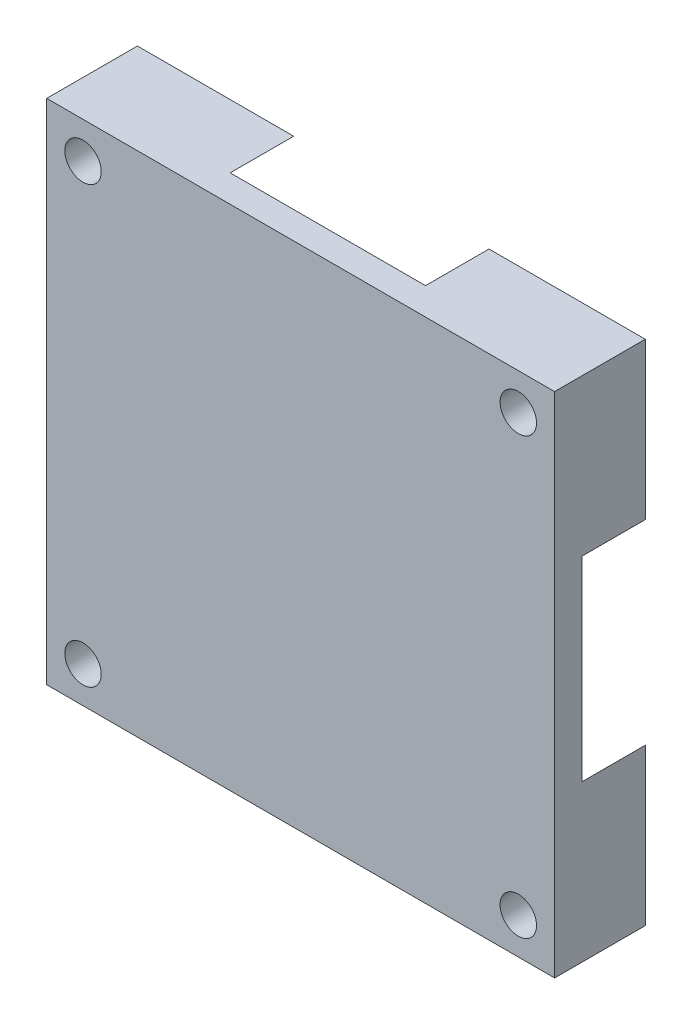
ISO-10303-21;
HEADER;
FILE_DESCRIPTION(('STEP AP214'),'2;1');
FILE_NAME('part.step','',(''),(''),'','','');
FILE_SCHEMA(('AUTOMOTIVE_DESIGN { 1 0 10303 214 1 1 1 1 }'));
ENDSEC;
DATA;
#1=APPLICATION_CONTEXT('core data for automotive mechanical design processes');
#2=APPLICATION_PROTOCOL_DEFINITION('international standard','automotive_design',2000,#1);
#3=PRODUCT_CONTEXT('',#1,'mechanical');
#4=PRODUCT('Part','Part','',(#3));
#5=PRODUCT_RELATED_PRODUCT_CATEGORY('part','',(#4));
#6=PRODUCT_DEFINITION_FORMATION('','',#4);
#7=PRODUCT_DEFINITION_CONTEXT('part definition',#1,'design');
#8=PRODUCT_DEFINITION('design','',#6,#7);
#9=PRODUCT_DEFINITION_SHAPE('','',#8);
#10=(LENGTH_UNIT() NAMED_UNIT(*) SI_UNIT(.MILLI.,.METRE.));
#11=(NAMED_UNIT(*) PLANE_ANGLE_UNIT() SI_UNIT($,.RADIAN.));
#12=(NAMED_UNIT(*) SI_UNIT($,.STERADIAN.) SOLID_ANGLE_UNIT());
#13=UNCERTAINTY_MEASURE_WITH_UNIT(LENGTH_MEASURE(1.E-05),#10,'distance_accuracy_value','');
#14=(GEOMETRIC_REPRESENTATION_CONTEXT(3) GLOBAL_UNCERTAINTY_ASSIGNED_CONTEXT((#13)) GLOBAL_UNIT_ASSIGNED_CONTEXT((#10,
#11,#12)) REPRESENTATION_CONTEXT('',''));
#15=CARTESIAN_POINT('',(0.,0.,0.));
#16=DIRECTION('',(0.,0.,1.));
#17=DIRECTION('',(1.,0.,0.));
#18=AXIS2_PLACEMENT_3D('',#15,#16,#17);
#19=CARTESIAN_POINT('',(-35.56,35.56,0.));
#20=DIRECTION('',(0.,0.,1.));
#21=DIRECTION('',(1.,0.,0.));
#22=AXIS2_PLACEMENT_3D('',#19,#20,#21);
#23=PLANE('',#22);
#24=CARTESIAN_POINT('',(30.48,30.48,0.));
#25=DIRECTION('',(0.,0.,1.));
#26=DIRECTION('',(1.,0.,0.));
#27=AXIS2_PLACEMENT_3D('',#24,#25,#26);
#28=CIRCLE('',#27,2.55269999999999);
#29=CARTESIAN_POINT('',(33.0327,30.48,0.));
#30=VERTEX_POINT('',#29);
#31=EDGE_CURVE('E241',#30,#30,#28,.T.);
#32=ORIENTED_EDGE('',*,*,#31,.T.);
#33=EDGE_LOOP('',(#32));
#34=FACE_BOUND('',#33,.T.);
#35=DIRECTION('',(0.,1.,0.));
#36=VECTOR('',#35,1.);
#37=CARTESIAN_POINT('',(35.56,-35.56,0.));
#38=LINE('',#37,#36);
#39=CARTESIAN_POINT('',(35.56,13.6783186101217,0.));
#40=VERTEX_POINT('',#39);
#41=CARTESIAN_POINT('',(35.56,35.56,0.));
#42=VERTEX_POINT('',#41);
#43=EDGE_CURVE('E181',#40,#42,#38,.T.);
#44=ORIENTED_EDGE('',*,*,#43,.F.);
#45=CARTESIAN_POINT('',(0.,0.,0.));
#46=DIRECTION('',(0.,0.,1.));
#47=DIRECTION('',(1.,0.,0.));
#48=AXIS2_PLACEMENT_3D('',#45,#46,#47);
#49=CIRCLE('',#48,38.1);
#50=CARTESIAN_POINT('',(13.6783186101217,35.56,0.));
#51=VERTEX_POINT('',#50);
#52=EDGE_CURVE('E40',#40,#51,#49,.T.);
#53=ORIENTED_EDGE('',*,*,#52,.T.);
#54=DIRECTION('',(-1.,0.,0.));
#55=VECTOR('',#54,1.);
#56=CARTESIAN_POINT('',(35.56,35.56,0.));
#57=LINE('',#56,#55);
#58=EDGE_CURVE('E170',#42,#51,#57,.T.);
#59=ORIENTED_EDGE('',*,*,#58,.F.);
#60=EDGE_LOOP('',(#44,#53,#59));
#61=FACE_BOUND('',#60,.T.);
#62=ADVANCED_FACE('F31',(#34,#61),#23,.F.);
#63=CARTESIAN_POINT('',(-30.48,30.48,0.));
#64=DIRECTION('',(0.,0.,1.));
#65=DIRECTION('',(1.,0.,0.));
#66=AXIS2_PLACEMENT_3D('',#63,#64,#65);
#67=CIRCLE('',#66,2.55269999999999);
#68=CARTESIAN_POINT('',(-27.9273,30.48,0.));
#69=VERTEX_POINT('',#68);
#70=EDGE_CURVE('E235',#69,#69,#67,.T.);
#71=ORIENTED_EDGE('',*,*,#70,.T.);
#72=EDGE_LOOP('',(#71));
#73=FACE_BOUND('',#72,.T.);
#74=CARTESIAN_POINT('',(-13.6783186101217,35.56,0.));
#75=VERTEX_POINT('',#74);
#76=CARTESIAN_POINT('',(-35.56,35.56,0.));
#77=VERTEX_POINT('',#76);
#78=EDGE_CURVE('E77',#75,#77,#57,.T.);
#79=ORIENTED_EDGE('',*,*,#78,.F.);
#80=CARTESIAN_POINT('',(0.,0.,0.));
#81=DIRECTION('',(0.,0.,-1.));
#82=DIRECTION('',(-1.,0.,0.));
#83=AXIS2_PLACEMENT_3D('',#80,#81,#82);
#84=CIRCLE('',#83,38.1);
#85=CARTESIAN_POINT('',(-35.56,13.6783186101217,0.));
#86=VERTEX_POINT('',#85);
#87=EDGE_CURVE('E224',#86,#75,#84,.T.);
#88=ORIENTED_EDGE('',*,*,#87,.F.);
#89=DIRECTION('',(0.,-1.,0.));
#90=VECTOR('',#89,1.);
#91=CARTESIAN_POINT('',(-35.56,-35.56,0.));
#92=LINE('',#91,#90);
#93=EDGE_CURVE('E155',#77,#86,#92,.T.);
#94=ORIENTED_EDGE('',*,*,#93,.F.);
#95=EDGE_LOOP('',(#79,#88,#94));
#96=FACE_BOUND('',#95,.T.);
#97=ADVANCED_FACE('F288',(#73,#96),#23,.F.);
#98=CARTESIAN_POINT('',(-30.48,-30.48,0.));
#99=DIRECTION('',(0.,0.,1.));
#100=DIRECTION('',(1.,0.,0.));
#101=AXIS2_PLACEMENT_3D('',#98,#99,#100);
#102=CIRCLE('',#101,2.5527);
#103=CARTESIAN_POINT('',(-27.9273,-30.48,0.));
#104=VERTEX_POINT('',#103);
#105=EDGE_CURVE('E229',#104,#104,#102,.T.);
#106=ORIENTED_EDGE('',*,*,#105,.T.);
#107=EDGE_LOOP('',(#106));
#108=FACE_BOUND('',#107,.T.);
#109=CARTESIAN_POINT('',(-35.56,-13.6783186101217,0.));
#110=VERTEX_POINT('',#109);
#111=CARTESIAN_POINT('',(-35.56,-35.56,0.));
#112=VERTEX_POINT('',#111);
#113=EDGE_CURVE('E142',#110,#112,#92,.T.);
#114=ORIENTED_EDGE('',*,*,#113,.F.);
#115=CARTESIAN_POINT('',(-13.6783186101217,-35.56,0.));
#116=VERTEX_POINT('',#115);
#117=EDGE_CURVE('E197',#110,#116,#49,.T.);
#118=ORIENTED_EDGE('',*,*,#117,.T.);
#119=DIRECTION('',(1.,0.,0.));
#120=VECTOR('',#119,1.);
#121=CARTESIAN_POINT('',(35.56,-35.56,0.));
#122=LINE('',#121,#120);
#123=EDGE_CURVE('E178',#112,#116,#122,.T.);
#124=ORIENTED_EDGE('',*,*,#123,.F.);
#125=EDGE_LOOP('',(#114,#118,#124));
#126=FACE_BOUND('',#125,.T.);
#127=ADVANCED_FACE('F268',(#108,#126),#23,.F.);
#128=CARTESIAN_POINT('',(-35.56,-35.56,12.7));
#129=DIRECTION('',(1.,0.,0.));
#130=DIRECTION('',(0.,0.,-1.));
#131=AXIS2_PLACEMENT_3D('',#128,#129,#130);
#132=PLANE('',#131);
#133=DIRECTION('',(0.,1.,0.));
#134=VECTOR('',#133,1.);
#135=CARTESIAN_POINT('',(-35.56,-35.56,8.89));
#136=LINE('',#135,#134);
#137=CARTESIAN_POINT('',(-35.56,-13.6783186101217,8.89));
#138=VERTEX_POINT('',#137);
#139=CARTESIAN_POINT('',(-35.56,13.6783186101217,8.89));
#140=VERTEX_POINT('',#139);
#141=EDGE_CURVE('E132',#138,#140,#136,.T.);
#142=ORIENTED_EDGE('',*,*,#141,.F.);
#143=DIRECTION('',(0.,0.,-1.));
#144=VECTOR('',#143,1.);
#145=CARTESIAN_POINT('',(-35.56,-13.6783186101217,8.89));
#146=LINE('',#145,#144);
#147=EDGE_CURVE('E156',#138,#110,#146,.T.);
#148=ORIENTED_EDGE('',*,*,#147,.T.);
#149=ORIENTED_EDGE('',*,*,#113,.T.);
#150=DIRECTION('',(0.,0.,-1.));
#151=VECTOR('',#150,1.);
#152=CARTESIAN_POINT('',(-35.56,-35.56,12.7));
#153=LINE('',#152,#151);
#154=CARTESIAN_POINT('',(-35.56,-35.56,12.7));
#155=VERTEX_POINT('',#154);
#156=EDGE_CURVE('E194',#155,#112,#153,.T.);
#157=ORIENTED_EDGE('',*,*,#156,.F.);
#158=DIRECTION('',(0.,-1.,0.));
#159=VECTOR('',#158,1.);
#160=CARTESIAN_POINT('',(-35.56,-35.56,12.7));
#161=LINE('',#160,#159);
#162=CARTESIAN_POINT('',(-35.56,35.56,12.7));
#163=VERTEX_POINT('',#162);
#164=EDGE_CURVE('E168',#163,#155,#161,.T.);
#165=ORIENTED_EDGE('',*,*,#164,.F.);
#166=DIRECTION('',(0.,0.,-1.));
#167=VECTOR('',#166,1.);
#168=CARTESIAN_POINT('',(-35.56,35.56,12.7));
#169=LINE('',#168,#167);
#170=EDGE_CURVE('E175',#163,#77,#169,.T.);
#171=ORIENTED_EDGE('',*,*,#170,.T.);
#172=ORIENTED_EDGE('',*,*,#93,.T.);
#173=DIRECTION('',(0.,0.,-1.));
#174=VECTOR('',#173,1.);
#175=CARTESIAN_POINT('',(-35.56,13.6783186101217,8.89));
#176=LINE('',#175,#174);
#177=EDGE_CURVE('E147',#86,#140,#176,.F.);
#178=ORIENTED_EDGE('',*,*,#177,.T.);
#179=EDGE_LOOP('',(#142,#148,#149,#157,#165,#171,#172,#178));
#180=FACE_BOUND('',#179,.T.);
#181=ADVANCED_FACE('F33',(#180),#132,.F.);
#182=CARTESIAN_POINT('',(35.56,-35.56,12.7));
#183=DIRECTION('',(0.,1.,0.));
#184=DIRECTION('',(0.,0.,1.));
#185=AXIS2_PLACEMENT_3D('',#182,#183,#184);
#186=PLANE('',#185);
#187=DIRECTION('',(-1.,0.,0.));
#188=VECTOR('',#187,1.);
#189=CARTESIAN_POINT('',(35.56,-35.56,8.89));
#190=LINE('',#189,#188);
#191=CARTESIAN_POINT('',(13.6783186101217,-35.56,8.89));
#192=VERTEX_POINT('',#191);
#193=CARTESIAN_POINT('',(-13.6783186101217,-35.56,8.89));
#194=VERTEX_POINT('',#193);
#195=EDGE_CURVE('E143',#192,#194,#190,.T.);
#196=ORIENTED_EDGE('',*,*,#195,.F.);
#197=DIRECTION('',(0.,0.,-1.));
#198=VECTOR('',#197,1.);
#199=CARTESIAN_POINT('',(13.6783186101217,-35.56,8.89));
#200=LINE('',#199,#198);
#201=CARTESIAN_POINT('',(13.6783186101217,-35.56,0.));
#202=VERTEX_POINT('',#201);
#203=EDGE_CURVE('E157',#192,#202,#200,.T.);
#204=ORIENTED_EDGE('',*,*,#203,.T.);
#205=CARTESIAN_POINT('',(35.56,-35.56,0.));
#206=VERTEX_POINT('',#205);
#207=EDGE_CURVE('E177',#202,#206,#122,.T.);
#208=ORIENTED_EDGE('',*,*,#207,.T.);
#209=DIRECTION('',(0.,0.,-1.));
#210=VECTOR('',#209,1.);
#211=CARTESIAN_POINT('',(35.56,-35.56,12.7));
#212=LINE('',#211,#210);
#213=CARTESIAN_POINT('',(35.56,-35.56,12.7));
#214=VERTEX_POINT('',#213);
#215=EDGE_CURVE('E191',#214,#206,#212,.T.);
#216=ORIENTED_EDGE('',*,*,#215,.F.);
#217=DIRECTION('',(1.,0.,0.));
#218=VECTOR('',#217,1.);
#219=CARTESIAN_POINT('',(35.56,-35.56,12.7));
#220=LINE('',#219,#218);
#221=EDGE_CURVE('E85',#155,#214,#220,.T.);
#222=ORIENTED_EDGE('',*,*,#221,.F.);
#223=ORIENTED_EDGE('',*,*,#156,.T.);
#224=ORIENTED_EDGE('',*,*,#123,.T.);
#225=DIRECTION('',(0.,0.,-1.));
#226=VECTOR('',#225,1.);
#227=CARTESIAN_POINT('',(-13.6783186101217,-35.56,8.89));
#228=LINE('',#227,#226);
#229=EDGE_CURVE('E162',#116,#194,#228,.F.);
#230=ORIENTED_EDGE('',*,*,#229,.T.);
#231=EDGE_LOOP('',(#196,#204,#208,#216,#222,#223,#224,#230));
#232=FACE_BOUND('',#231,.T.);
#233=ADVANCED_FACE('F266',(#232),#186,.F.);
#234=CARTESIAN_POINT('',(35.56,-35.56,12.7));
#235=DIRECTION('',(-1.,0.,0.));
#236=DIRECTION('',(0.,0.,1.));
#237=AXIS2_PLACEMENT_3D('',#234,#235,#236);
#238=PLANE('',#237);
#239=DIRECTION('',(0.,-1.,0.));
#240=VECTOR('',#239,1.);
#241=CARTESIAN_POINT('',(35.56,-35.56,8.89));
#242=LINE('',#241,#240);
#243=CARTESIAN_POINT('',(35.56,13.6783186101217,8.89));
#244=VERTEX_POINT('',#243);
#245=CARTESIAN_POINT('',(35.56,-13.6783186101217,8.89));
#246=VERTEX_POINT('',#245);
#247=EDGE_CURVE('E159',#244,#246,#242,.T.);
#248=ORIENTED_EDGE('',*,*,#247,.F.);
#249=DIRECTION('',(0.,0.,-1.));
#250=VECTOR('',#249,1.);
#251=CARTESIAN_POINT('',(35.56,13.6783186101217,8.89));
#252=LINE('',#251,#250);
#253=EDGE_CURVE('E215',#244,#40,#252,.T.);
#254=ORIENTED_EDGE('',*,*,#253,.T.);
#255=ORIENTED_EDGE('',*,*,#43,.T.);
#256=DIRECTION('',(0.,0.,-1.));
#257=VECTOR('',#256,1.);
#258=CARTESIAN_POINT('',(35.56,35.56,12.7));
#259=LINE('',#258,#257);
#260=CARTESIAN_POINT('',(35.56,35.56,12.7));
#261=VERTEX_POINT('',#260);
#262=EDGE_CURVE('E188',#261,#42,#259,.T.);
#263=ORIENTED_EDGE('',*,*,#262,.F.);
#264=DIRECTION('',(0.,1.,0.));
#265=VECTOR('',#264,1.);
#266=CARTESIAN_POINT('',(35.56,-35.56,12.7));
#267=LINE('',#266,#265);
#268=EDGE_CURVE('E172',#214,#261,#267,.T.);
#269=ORIENTED_EDGE('',*,*,#268,.F.);
#270=ORIENTED_EDGE('',*,*,#215,.T.);
#271=CARTESIAN_POINT('',(35.56,-13.6783186101217,0.));
#272=VERTEX_POINT('',#271);
#273=EDGE_CURVE('E182',#206,#272,#38,.T.);
#274=ORIENTED_EDGE('',*,*,#273,.T.);
#275=DIRECTION('',(0.,0.,-1.));
#276=VECTOR('',#275,1.);
#277=CARTESIAN_POINT('',(35.56,-13.6783186101217,8.89));
#278=LINE('',#277,#276);
#279=EDGE_CURVE('E47',#272,#246,#278,.F.);
#280=ORIENTED_EDGE('',*,*,#279,.T.);
#281=EDGE_LOOP('',(#248,#254,#255,#263,#269,#270,#274,#280));
#282=FACE_BOUND('',#281,.T.);
#283=ADVANCED_FACE('F214',(#282),#238,.F.);
#284=CARTESIAN_POINT('',(35.56,35.56,12.7));
#285=DIRECTION('',(0.,-1.,0.));
#286=DIRECTION('',(0.,0.,-1.));
#287=AXIS2_PLACEMENT_3D('',#284,#285,#286);
#288=PLANE('',#287);
#289=DIRECTION('',(1.,0.,0.));
#290=VECTOR('',#289,1.);
#291=CARTESIAN_POINT('',(35.56,35.56,8.89));
#292=LINE('',#291,#290);
#293=CARTESIAN_POINT('',(-13.6783186101217,35.56,8.89));
#294=VERTEX_POINT('',#293);
#295=CARTESIAN_POINT('',(13.6783186101217,35.56,8.89));
#296=VERTEX_POINT('',#295);
#297=EDGE_CURVE('E11',#294,#296,#292,.T.);
#298=ORIENTED_EDGE('',*,*,#297,.F.);
#299=DIRECTION('',(0.,0.,-1.));
#300=VECTOR('',#299,1.);
#301=CARTESIAN_POINT('',(-13.6783186101217,35.56,8.89));
#302=LINE('',#301,#300);
#303=EDGE_CURVE('E149',#294,#75,#302,.T.);
#304=ORIENTED_EDGE('',*,*,#303,.T.);
#305=ORIENTED_EDGE('',*,*,#78,.T.);
#306=ORIENTED_EDGE('',*,*,#170,.F.);
#307=DIRECTION('',(-1.,0.,0.));
#308=VECTOR('',#307,1.);
#309=CARTESIAN_POINT('',(35.56,35.56,12.7));
#310=LINE('',#309,#308);
#311=EDGE_CURVE('E56',#261,#163,#310,.T.);
#312=ORIENTED_EDGE('',*,*,#311,.F.);
#313=ORIENTED_EDGE('',*,*,#262,.T.);
#314=ORIENTED_EDGE('',*,*,#58,.T.);
#315=DIRECTION('',(0.,0.,-1.));
#316=VECTOR('',#315,1.);
#317=CARTESIAN_POINT('',(13.6783186101217,35.56,8.89));
#318=LINE('',#317,#316);
#319=EDGE_CURVE('E150',#51,#296,#318,.F.);
#320=ORIENTED_EDGE('',*,*,#319,.T.);
#321=EDGE_LOOP('',(#298,#304,#305,#306,#312,#313,#314,#320));
#322=FACE_BOUND('',#321,.T.);
#323=ADVANCED_FACE('F209',(#322),#288,.F.);
#324=CARTESIAN_POINT('',(-35.56,35.56,12.7));
#325=DIRECTION('',(0.,0.,1.));
#326=DIRECTION('',(1.,0.,0.));
#327=AXIS2_PLACEMENT_3D('',#324,#325,#326);
#328=PLANE('',#327);
#329=CARTESIAN_POINT('',(30.48,30.48,12.7));
#330=DIRECTION('',(0.,0.,1.));
#331=DIRECTION('',(1.,0.,0.));
#332=AXIS2_PLACEMENT_3D('',#329,#330,#331);
#333=CIRCLE('',#332,2.5527);
#334=CARTESIAN_POINT('',(33.0327,30.48,12.7));
#335=VERTEX_POINT('',#334);
#336=EDGE_CURVE('E244',#335,#335,#333,.T.);
#337=ORIENTED_EDGE('',*,*,#336,.F.);
#338=EDGE_LOOP('',(#337));
#339=FACE_BOUND('',#338,.T.);
#340=CARTESIAN_POINT('',(-30.48,30.48,12.7));
#341=DIRECTION('',(0.,0.,1.));
#342=DIRECTION('',(1.,0.,0.));
#343=AXIS2_PLACEMENT_3D('',#340,#341,#342);
#344=CIRCLE('',#343,2.5527);
#345=CARTESIAN_POINT('',(-27.9273,30.48,12.7));
#346=VERTEX_POINT('',#345);
#347=EDGE_CURVE('E238',#346,#346,#344,.T.);
#348=ORIENTED_EDGE('',*,*,#347,.F.);
#349=EDGE_LOOP('',(#348));
#350=FACE_BOUND('',#349,.T.);
#351=CARTESIAN_POINT('',(-30.48,-30.48,12.7));
#352=DIRECTION('',(0.,0.,1.));
#353=DIRECTION('',(1.,0.,0.));
#354=AXIS2_PLACEMENT_3D('',#351,#352,#353);
#355=CIRCLE('',#354,2.5527);
#356=CARTESIAN_POINT('',(-27.9273,-30.48,12.7));
#357=VERTEX_POINT('',#356);
#358=EDGE_CURVE('E232',#357,#357,#355,.T.);
#359=ORIENTED_EDGE('',*,*,#358,.F.);
#360=EDGE_LOOP('',(#359));
#361=FACE_BOUND('',#360,.T.);
#362=CARTESIAN_POINT('',(30.48,-30.48,12.7));
#363=DIRECTION('',(0.,0.,1.));
#364=DIRECTION('',(1.,0.,0.));
#365=AXIS2_PLACEMENT_3D('',#362,#363,#364);
#366=CIRCLE('',#365,2.5527);
#367=CARTESIAN_POINT('',(33.0327,-30.48,12.7));
#368=VERTEX_POINT('',#367);
#369=EDGE_CURVE('E226',#368,#368,#366,.T.);
#370=ORIENTED_EDGE('',*,*,#369,.F.);
#371=EDGE_LOOP('',(#370));
#372=FACE_BOUND('',#371,.T.);
#373=ORIENTED_EDGE('',*,*,#164,.T.);
#374=ORIENTED_EDGE('',*,*,#221,.T.);
#375=ORIENTED_EDGE('',*,*,#268,.T.);
#376=ORIENTED_EDGE('',*,*,#311,.T.);
#377=EDGE_LOOP('',(#373,#374,#375,#376));
#378=FACE_BOUND('',#377,.T.);
#379=ADVANCED_FACE('F251',(#339,#350,#361,#372,#378),#328,.T.);
#380=CARTESIAN_POINT('',(30.48,-30.48,0.));
#381=DIRECTION('',(0.,0.,1.));
#382=DIRECTION('',(1.,0.,0.));
#383=AXIS2_PLACEMENT_3D('',#380,#381,#382);
#384=CIRCLE('',#383,2.55269999999999);
#385=CARTESIAN_POINT('',(33.0327,-30.48,0.));
#386=VERTEX_POINT('',#385);
#387=EDGE_CURVE('E35',#386,#386,#384,.T.);
#388=ORIENTED_EDGE('',*,*,#387,.T.);
#389=EDGE_LOOP('',(#388));
#390=FACE_BOUND('',#389,.T.);
#391=ORIENTED_EDGE('',*,*,#207,.F.);
#392=EDGE_CURVE('E196',#202,#272,#49,.T.);
#393=ORIENTED_EDGE('',*,*,#392,.T.);
#394=ORIENTED_EDGE('',*,*,#273,.F.);
#395=EDGE_LOOP('',(#391,#393,#394));
#396=FACE_BOUND('',#395,.T.);
#397=ADVANCED_FACE('F254',(#390,#396),#23,.F.);
#398=CARTESIAN_POINT('',(0.,0.,8.89));
#399=DIRECTION('',(0.,0.,-1.));
#400=DIRECTION('',(-1.,0.,0.));
#401=AXIS2_PLACEMENT_3D('',#398,#399,#400);
#402=PLANE('',#401);
#403=ORIENTED_EDGE('',*,*,#141,.T.);
#404=CARTESIAN_POINT('',(0.,0.,8.89));
#405=DIRECTION('',(0.,0.,-1.));
#406=DIRECTION('',(-1.,0.,0.));
#407=AXIS2_PLACEMENT_3D('',#404,#405,#406);
#408=CIRCLE('',#407,38.1);
#409=EDGE_CURVE('E135',#140,#294,#408,.T.);
#410=ORIENTED_EDGE('',*,*,#409,.T.);
#411=ORIENTED_EDGE('',*,*,#297,.T.);
#412=EDGE_CURVE('E151',#296,#244,#408,.T.);
#413=ORIENTED_EDGE('',*,*,#412,.T.);
#414=ORIENTED_EDGE('',*,*,#247,.T.);
#415=EDGE_CURVE('E271',#246,#192,#408,.T.);
#416=ORIENTED_EDGE('',*,*,#415,.T.);
#417=ORIENTED_EDGE('',*,*,#195,.T.);
#418=EDGE_CURVE('E138',#194,#138,#408,.T.);
#419=ORIENTED_EDGE('',*,*,#418,.T.);
#420=EDGE_LOOP('',(#403,#410,#411,#413,#414,#416,#417,#419));
#421=FACE_BOUND('',#420,.T.);
#422=ADVANCED_FACE('F134',(#421),#402,.T.);
#423=CARTESIAN_POINT('',(0.,0.,8.89));
#424=DIRECTION('',(0.,0.,-1.));
#425=DIRECTION('',(-1.,0.,0.));
#426=AXIS2_PLACEMENT_3D('',#423,#424,#425);
#427=CYLINDRICAL_SURFACE('',#426,38.1);
#428=ORIENTED_EDGE('',*,*,#418,.F.);
#429=ORIENTED_EDGE('',*,*,#229,.F.);
#430=ORIENTED_EDGE('',*,*,#117,.F.);
#431=ORIENTED_EDGE('',*,*,#147,.F.);
#432=EDGE_LOOP('',(#428,#429,#430,#431));
#433=FACE_BOUND('',#432,.T.);
#434=ADVANCED_FACE('F270',(#433),#427,.F.);
#435=ORIENTED_EDGE('',*,*,#87,.T.);
#436=ORIENTED_EDGE('',*,*,#303,.F.);
#437=ORIENTED_EDGE('',*,*,#409,.F.);
#438=ORIENTED_EDGE('',*,*,#177,.F.);
#439=EDGE_LOOP('',(#435,#436,#437,#438));
#440=FACE_BOUND('',#439,.T.);
#441=ADVANCED_FACE('F146',(#440),#427,.F.);
#442=ORIENTED_EDGE('',*,*,#415,.F.);
#443=ORIENTED_EDGE('',*,*,#279,.F.);
#444=ORIENTED_EDGE('',*,*,#392,.F.);
#445=ORIENTED_EDGE('',*,*,#203,.F.);
#446=EDGE_LOOP('',(#442,#443,#444,#445));
#447=FACE_BOUND('',#446,.T.);
#448=ADVANCED_FACE('F276',(#447),#427,.F.);
#449=ORIENTED_EDGE('',*,*,#412,.F.);
#450=ORIENTED_EDGE('',*,*,#319,.F.);
#451=ORIENTED_EDGE('',*,*,#52,.F.);
#452=ORIENTED_EDGE('',*,*,#253,.F.);
#453=EDGE_LOOP('',(#449,#450,#451,#452));
#454=FACE_BOUND('',#453,.T.);
#455=ADVANCED_FACE('F273',(#454),#427,.F.);
#456=CARTESIAN_POINT('',(30.48,-30.48,12.7));
#457=DIRECTION('',(0.,0.,1.));
#458=DIRECTION('',(1.,0.,0.));
#459=AXIS2_PLACEMENT_3D('',#456,#457,#458);
#460=CYLINDRICAL_SURFACE('',#459,2.55269999999999);
#461=ORIENTED_EDGE('',*,*,#369,.T.);
#462=EDGE_LOOP('',(#461));
#463=FACE_BOUND('',#462,.T.);
#464=ORIENTED_EDGE('',*,*,#387,.F.);
#465=EDGE_LOOP('',(#464));
#466=FACE_BOUND('',#465,.T.);
#467=ADVANCED_FACE('F275',(#463,#466),#460,.F.);
#468=CARTESIAN_POINT('',(-30.48,-30.48,12.7));
#469=DIRECTION('',(0.,0.,1.));
#470=DIRECTION('',(1.,0.,0.));
#471=AXIS2_PLACEMENT_3D('',#468,#469,#470);
#472=CYLINDRICAL_SURFACE('',#471,2.5527);
#473=ORIENTED_EDGE('',*,*,#358,.T.);
#474=EDGE_LOOP('',(#473));
#475=FACE_BOUND('',#474,.T.);
#476=ORIENTED_EDGE('',*,*,#105,.F.);
#477=EDGE_LOOP('',(#476));
#478=FACE_BOUND('',#477,.T.);
#479=ADVANCED_FACE('F282',(#475,#478),#472,.F.);
#480=CARTESIAN_POINT('',(-30.48,30.48,12.7));
#481=DIRECTION('',(0.,0.,1.));
#482=DIRECTION('',(1.,0.,0.));
#483=AXIS2_PLACEMENT_3D('',#480,#481,#482);
#484=CYLINDRICAL_SURFACE('',#483,2.55269999999999);
#485=ORIENTED_EDGE('',*,*,#347,.T.);
#486=EDGE_LOOP('',(#485));
#487=FACE_BOUND('',#486,.T.);
#488=ORIENTED_EDGE('',*,*,#70,.F.);
#489=EDGE_LOOP('',(#488));
#490=FACE_BOUND('',#489,.T.);
#491=ADVANCED_FACE('F310',(#487,#490),#484,.F.);
#492=CARTESIAN_POINT('',(30.48,30.48,12.7));
#493=DIRECTION('',(0.,0.,1.));
#494=DIRECTION('',(1.,0.,0.));
#495=AXIS2_PLACEMENT_3D('',#492,#493,#494);
#496=CYLINDRICAL_SURFACE('',#495,2.55269999999999);
#497=ORIENTED_EDGE('',*,*,#336,.T.);
#498=EDGE_LOOP('',(#497));
#499=FACE_BOUND('',#498,.T.);
#500=ORIENTED_EDGE('',*,*,#31,.F.);
#501=EDGE_LOOP('',(#500));
#502=FACE_BOUND('',#501,.T.);
#503=ADVANCED_FACE('F248',(#499,#502),#496,.F.);
#504=CLOSED_SHELL('',(#62,#97,#127,#181,#233,#283,#323,#379,#397,#422,#434,#441,#448,#455,#467,
#479,#491,#503));
#505=MANIFOLD_SOLID_BREP('B2',#504);
#506=ADVANCED_BREP_SHAPE_REPRESENTATION('',(#18,#505),#14);
#507=SHAPE_DEFINITION_REPRESENTATION(#9,#506);
ENDSEC;
END-ISO-10303-21;
